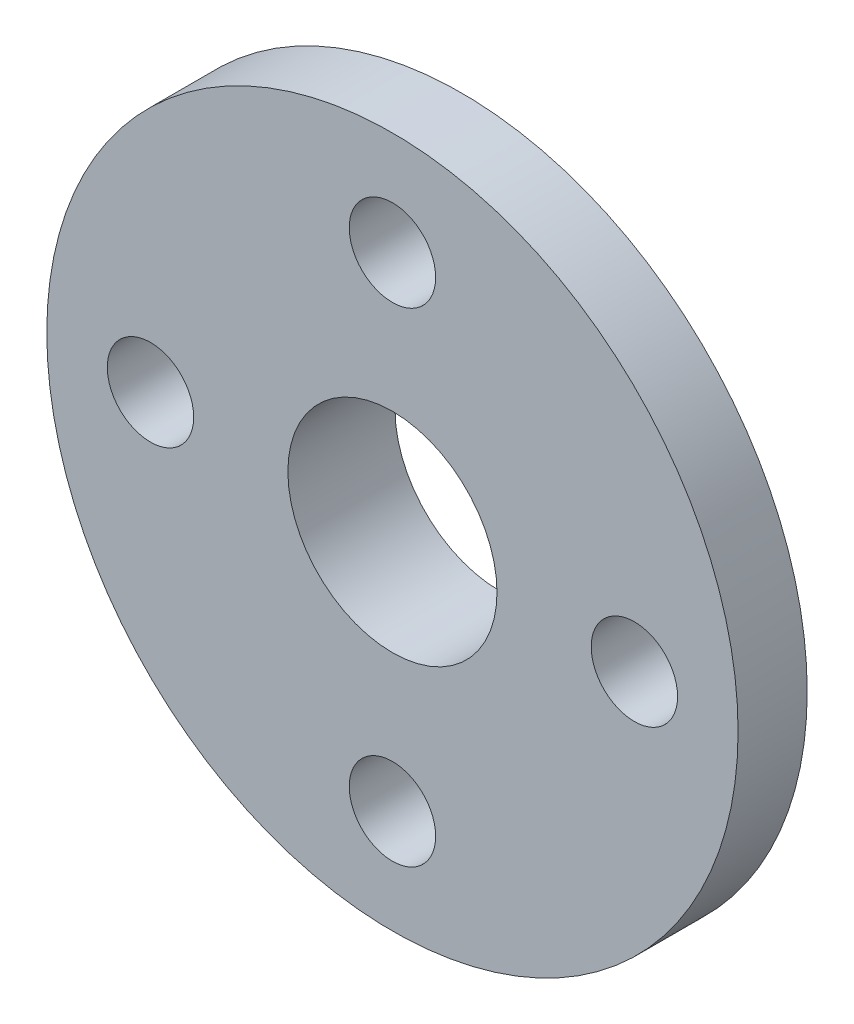
ISO-10303-21;
HEADER;
FILE_DESCRIPTION(('STEP AP214'),'2;1');
FILE_NAME('part.step','',(''),(''),'','','');
FILE_SCHEMA(('AUTOMOTIVE_DESIGN { 1 0 10303 214 1 1 1 1 }'));
ENDSEC;
DATA;
#1=APPLICATION_CONTEXT('core data for automotive mechanical design processes');
#2=APPLICATION_PROTOCOL_DEFINITION('international standard','automotive_design',2000,#1);
#3=PRODUCT_CONTEXT('',#1,'mechanical');
#4=PRODUCT('Part','Part','',(#3));
#5=PRODUCT_RELATED_PRODUCT_CATEGORY('part','',(#4));
#6=PRODUCT_DEFINITION_FORMATION('','',#4);
#7=PRODUCT_DEFINITION_CONTEXT('part definition',#1,'design');
#8=PRODUCT_DEFINITION('design','',#6,#7);
#9=PRODUCT_DEFINITION_SHAPE('','',#8);
#10=(LENGTH_UNIT() NAMED_UNIT(*) SI_UNIT(.MILLI.,.METRE.));
#11=(NAMED_UNIT(*) PLANE_ANGLE_UNIT() SI_UNIT($,.RADIAN.));
#12=(NAMED_UNIT(*) SI_UNIT($,.STERADIAN.) SOLID_ANGLE_UNIT());
#13=UNCERTAINTY_MEASURE_WITH_UNIT(LENGTH_MEASURE(1.E-05),#10,'distance_accuracy_value','');
#14=(GEOMETRIC_REPRESENTATION_CONTEXT(3) GLOBAL_UNCERTAINTY_ASSIGNED_CONTEXT((#13)) GLOBAL_UNIT_ASSIGNED_CONTEXT((#10,
#11,#12)) REPRESENTATION_CONTEXT('',''));
#15=CARTESIAN_POINT('',(0.,0.,0.));
#16=DIRECTION('',(0.,0.,1.));
#17=DIRECTION('',(1.,0.,0.));
#18=AXIS2_PLACEMENT_3D('',#15,#16,#17);
#19=CARTESIAN_POINT('',(-39.10264651977,-19.8999981269,6.716));
#20=DIRECTION('',(0.,0.,-1.));
#21=DIRECTION('',(-1.,0.,0.));
#22=AXIS2_PLACEMENT_3D('',#19,#20,#21);
#23=CYLINDRICAL_SURFACE('',#22,4.5);
#24=CARTESIAN_POINT('',(-39.10264651977,-19.8999981269,9.476));
#25=DIRECTION('',(0.,0.,-1.));
#26=DIRECTION('',(-1.,0.,0.));
#27=AXIS2_PLACEMENT_3D('',#24,#25,#26);
#28=CIRCLE('',#27,4.5);
#29=CARTESIAN_POINT('',(-43.60264651977,-19.8999981269,9.476));
#30=VERTEX_POINT('',#29);
#31=EDGE_CURVE('E17',#30,#30,#28,.F.);
#32=ORIENTED_EDGE('',*,*,#31,.F.);
#33=EDGE_LOOP('',(#32));
#34=FACE_BOUND('',#33,.T.);
#35=CARTESIAN_POINT('',(-39.10264651977,-19.8999981269,8.376));
#36=DIRECTION('',(0.,0.,-1.));
#37=DIRECTION('',(-1.,0.,0.));
#38=AXIS2_PLACEMENT_3D('',#35,#36,#37);
#39=CIRCLE('',#38,4.5);
#40=CARTESIAN_POINT('',(-43.60264651977,-19.8999981269,8.376));
#41=VERTEX_POINT('',#40);
#42=EDGE_CURVE('E57',#41,#41,#39,.F.);
#43=ORIENTED_EDGE('',*,*,#42,.T.);
#44=EDGE_LOOP('',(#43));
#45=FACE_BOUND('',#44,.T.);
#46=ADVANCED_FACE('F14',(#34,#45),#23,.T.);
#47=CARTESIAN_POINT('',(-39.10264565297,-19.9,9.476));
#48=DIRECTION('',(0.,0.,-1.));
#49=DIRECTION('',(-1.,0.,0.));
#50=AXIS2_PLACEMENT_3D('',#47,#48,#49);
#51=PLANE('',#50);
#52=CARTESIAN_POINT('',(-46.10264464667,-19.8999981269,9.476));
#53=DIRECTION('',(0.,0.,1.));
#54=DIRECTION('',(1.,0.,0.));
#55=AXIS2_PLACEMENT_3D('',#52,#53,#54);
#56=CIRCLE('',#55,1.25);
#57=CARTESIAN_POINT('',(-44.85264464667,-19.8999981269,9.476));
#58=VERTEX_POINT('',#57);
#59=EDGE_CURVE('E52',#58,#58,#56,.T.);
#60=ORIENTED_EDGE('',*,*,#59,.T.);
#61=EDGE_LOOP('',(#60));
#62=FACE_BOUND('',#61,.T.);
#63=CARTESIAN_POINT('',(-39.10264651977,-26.8999962538,9.476));
#64=DIRECTION('',(0.,0.,1.));
#65=DIRECTION('',(1.,0.,0.));
#66=AXIS2_PLACEMENT_3D('',#63,#64,#65);
#67=CIRCLE('',#66,1.25);
#68=CARTESIAN_POINT('',(-37.85264651977,-26.8999962538,9.476));
#69=VERTEX_POINT('',#68);
#70=EDGE_CURVE('E49',#69,#69,#67,.T.);
#71=ORIENTED_EDGE('',*,*,#70,.T.);
#72=EDGE_LOOP('',(#71));
#73=FACE_BOUND('',#72,.T.);
#74=CARTESIAN_POINT('',(-32.10264839287,-19.8999981269,9.476));
#75=DIRECTION('',(0.,0.,1.));
#76=DIRECTION('',(1.,0.,0.));
#77=AXIS2_PLACEMENT_3D('',#74,#75,#76);
#78=CIRCLE('',#77,1.25);
#79=CARTESIAN_POINT('',(-30.85264839287,-19.8999981269,9.476));
#80=VERTEX_POINT('',#79);
#81=EDGE_CURVE('E46',#80,#80,#78,.T.);
#82=ORIENTED_EDGE('',*,*,#81,.T.);
#83=EDGE_LOOP('',(#82));
#84=FACE_BOUND('',#83,.T.);
#85=CARTESIAN_POINT('',(-39.10264651977,-12.9,9.476));
#86=DIRECTION('',(0.,0.,1.));
#87=DIRECTION('',(1.,0.,0.));
#88=AXIS2_PLACEMENT_3D('',#85,#86,#87);
#89=CIRCLE('',#88,1.25);
#90=CARTESIAN_POINT('',(-37.85264651977,-12.9,9.476));
#91=VERTEX_POINT('',#90);
#92=EDGE_CURVE('E43',#91,#91,#89,.T.);
#93=ORIENTED_EDGE('',*,*,#92,.T.);
#94=EDGE_LOOP('',(#93));
#95=FACE_BOUND('',#94,.T.);
#96=ORIENTED_EDGE('',*,*,#31,.T.);
#97=EDGE_LOOP('',(#96));
#98=FACE_BOUND('',#97,.T.);
#99=CARTESIAN_POINT('',(-39.10264651977,-19.8999981269,9.476));
#100=DIRECTION('',(0.,0.,1.));
#101=DIRECTION('',(1.,0.,0.));
#102=AXIS2_PLACEMENT_3D('',#99,#100,#101);
#103=CIRCLE('',#102,10.);
#104=CARTESIAN_POINT('',(-29.10264651977,-19.8999981269,9.476));
#105=VERTEX_POINT('',#104);
#106=EDGE_CURVE('E55',#105,#105,#103,.T.);
#107=ORIENTED_EDGE('',*,*,#106,.F.);
#108=EDGE_LOOP('',(#107));
#109=FACE_BOUND('',#108,.T.);
#110=ADVANCED_FACE('F64',(#62,#73,#84,#95,#98,#109),#51,.T.);
#111=CARTESIAN_POINT('',(-28.10437565297,-19.9,8.376));
#112=DIRECTION('',(0.,0.,1.));
#113=DIRECTION('',(1.,0.,0.));
#114=AXIS2_PLACEMENT_3D('',#111,#112,#113);
#115=PLANE('',#114);
#116=CARTESIAN_POINT('',(-39.10264651977,-19.8999981269,8.376));
#117=DIRECTION('',(0.,0.,1.));
#118=DIRECTION('',(1.,0.,0.));
#119=AXIS2_PLACEMENT_3D('',#116,#117,#118);
#120=CIRCLE('',#119,3.025);
#121=CARTESIAN_POINT('',(-36.07764651977,-19.8999981269,8.376));
#122=VERTEX_POINT('',#121);
#123=EDGE_CURVE('E40',#122,#122,#120,.T.);
#124=ORIENTED_EDGE('',*,*,#123,.T.);
#125=EDGE_LOOP('',(#124));
#126=FACE_BOUND('',#125,.T.);
#127=ORIENTED_EDGE('',*,*,#42,.F.);
#128=EDGE_LOOP('',(#127));
#129=FACE_BOUND('',#128,.T.);
#130=ADVANCED_FACE('F72',(#126,#129),#115,.F.);
#131=CARTESIAN_POINT('',(-39.10264651977,-19.8999981269,11.476));
#132=DIRECTION('',(0.,0.,1.));
#133=DIRECTION('',(1.,0.,0.));
#134=AXIS2_PLACEMENT_3D('',#131,#132,#133);
#135=CYLINDRICAL_SURFACE('',#134,10.);
#136=ORIENTED_EDGE('',*,*,#106,.T.);
#137=EDGE_LOOP('',(#136));
#138=FACE_BOUND('',#137,.T.);
#139=CARTESIAN_POINT('',(-39.10264651977,-19.8999981269,11.476));
#140=DIRECTION('',(0.,0.,1.));
#141=DIRECTION('',(1.,0.,0.));
#142=AXIS2_PLACEMENT_3D('',#139,#140,#141);
#143=CIRCLE('',#142,10.);
#144=CARTESIAN_POINT('',(-29.10264651977,-19.8999981269,11.476));
#145=VERTEX_POINT('',#144);
#146=EDGE_CURVE('E37',#145,#145,#143,.F.);
#147=ORIENTED_EDGE('',*,*,#146,.T.);
#148=EDGE_LOOP('',(#147));
#149=FACE_BOUND('',#148,.T.);
#150=ADVANCED_FACE('F100',(#138,#149),#135,.T.);
#151=CARTESIAN_POINT('',(-46.10264464667,-19.8999981269,11.476));
#152=DIRECTION('',(0.,0.,1.));
#153=DIRECTION('',(1.,0.,0.));
#154=AXIS2_PLACEMENT_3D('',#151,#152,#153);
#155=CYLINDRICAL_SURFACE('',#154,1.25);
#156=CARTESIAN_POINT('',(-46.10264464667,-19.8999981269,11.476));
#157=DIRECTION('',(0.,0.,1.));
#158=DIRECTION('',(1.,0.,0.));
#159=AXIS2_PLACEMENT_3D('',#156,#157,#158);
#160=CIRCLE('',#159,1.25);
#161=CARTESIAN_POINT('',(-44.85264464667,-19.8999981269,11.476));
#162=VERTEX_POINT('',#161);
#163=EDGE_CURVE('E34',#162,#162,#160,.T.);
#164=ORIENTED_EDGE('',*,*,#163,.T.);
#165=EDGE_LOOP('',(#164));
#166=FACE_BOUND('',#165,.T.);
#167=ORIENTED_EDGE('',*,*,#59,.F.);
#168=EDGE_LOOP('',(#167));
#169=FACE_BOUND('',#168,.T.);
#170=ADVANCED_FACE('F96',(#166,#169),#155,.F.);
#171=CARTESIAN_POINT('',(-39.10264651977,-26.8999962538,11.476));
#172=DIRECTION('',(0.,0.,1.));
#173=DIRECTION('',(1.,0.,0.));
#174=AXIS2_PLACEMENT_3D('',#171,#172,#173);
#175=CYLINDRICAL_SURFACE('',#174,1.25);
#176=CARTESIAN_POINT('',(-39.10264651977,-26.8999962538,11.476));
#177=DIRECTION('',(0.,0.,1.));
#178=DIRECTION('',(1.,0.,0.));
#179=AXIS2_PLACEMENT_3D('',#176,#177,#178);
#180=CIRCLE('',#179,1.25);
#181=CARTESIAN_POINT('',(-37.85264651977,-26.8999962538,11.476));
#182=VERTEX_POINT('',#181);
#183=EDGE_CURVE('E31',#182,#182,#180,.T.);
#184=ORIENTED_EDGE('',*,*,#183,.T.);
#185=EDGE_LOOP('',(#184));
#186=FACE_BOUND('',#185,.T.);
#187=ORIENTED_EDGE('',*,*,#70,.F.);
#188=EDGE_LOOP('',(#187));
#189=FACE_BOUND('',#188,.T.);
#190=ADVANCED_FACE('F92',(#186,#189),#175,.F.);
#191=CARTESIAN_POINT('',(-32.10264839287,-19.8999981269,11.476));
#192=DIRECTION('',(0.,0.,1.));
#193=DIRECTION('',(1.,0.,0.));
#194=AXIS2_PLACEMENT_3D('',#191,#192,#193);
#195=CYLINDRICAL_SURFACE('',#194,1.25);
#196=CARTESIAN_POINT('',(-32.10264839287,-19.8999981269,11.476));
#197=DIRECTION('',(0.,0.,1.));
#198=DIRECTION('',(1.,0.,0.));
#199=AXIS2_PLACEMENT_3D('',#196,#197,#198);
#200=CIRCLE('',#199,1.25);
#201=CARTESIAN_POINT('',(-30.85264839287,-19.8999981269,11.476));
#202=VERTEX_POINT('',#201);
#203=EDGE_CURVE('E26',#202,#202,#200,.T.);
#204=ORIENTED_EDGE('',*,*,#203,.T.);
#205=EDGE_LOOP('',(#204));
#206=FACE_BOUND('',#205,.T.);
#207=ORIENTED_EDGE('',*,*,#81,.F.);
#208=EDGE_LOOP('',(#207));
#209=FACE_BOUND('',#208,.T.);
#210=ADVANCED_FACE('F88',(#206,#209),#195,.F.);
#211=CARTESIAN_POINT('',(-39.10264651977,-12.9,11.476));
#212=DIRECTION('',(0.,0.,1.));
#213=DIRECTION('',(1.,0.,0.));
#214=AXIS2_PLACEMENT_3D('',#211,#212,#213);
#215=CYLINDRICAL_SURFACE('',#214,1.25);
#216=CARTESIAN_POINT('',(-39.10264651977,-12.9,11.476));
#217=DIRECTION('',(0.,0.,1.));
#218=DIRECTION('',(1.,0.,0.));
#219=AXIS2_PLACEMENT_3D('',#216,#217,#218);
#220=CIRCLE('',#219,1.25);
#221=CARTESIAN_POINT('',(-37.85264651977,-12.9,11.476));
#222=VERTEX_POINT('',#221);
#223=EDGE_CURVE('E21',#222,#222,#220,.T.);
#224=ORIENTED_EDGE('',*,*,#223,.T.);
#225=EDGE_LOOP('',(#224));
#226=FACE_BOUND('',#225,.T.);
#227=ORIENTED_EDGE('',*,*,#92,.F.);
#228=EDGE_LOOP('',(#227));
#229=FACE_BOUND('',#228,.T.);
#230=ADVANCED_FACE('F82',(#226,#229),#215,.F.);
#231=CARTESIAN_POINT('',(-39.10264651977,-19.8999981269,12.426));
#232=DIRECTION('',(0.,0.,1.));
#233=DIRECTION('',(1.,0.,0.));
#234=AXIS2_PLACEMENT_3D('',#231,#232,#233);
#235=CYLINDRICAL_SURFACE('',#234,3.025);
#236=CARTESIAN_POINT('',(-39.10264651977,-19.8999981269,11.476));
#237=DIRECTION('',(0.,0.,1.));
#238=DIRECTION('',(1.,0.,0.));
#239=AXIS2_PLACEMENT_3D('',#236,#237,#238);
#240=CIRCLE('',#239,3.025);
#241=CARTESIAN_POINT('',(-36.07764651977,-19.8999981269,11.476));
#242=VERTEX_POINT('',#241);
#243=EDGE_CURVE('E9',#242,#242,#240,.T.);
#244=ORIENTED_EDGE('',*,*,#243,.T.);
#245=EDGE_LOOP('',(#244));
#246=FACE_BOUND('',#245,.T.);
#247=ORIENTED_EDGE('',*,*,#123,.F.);
#248=EDGE_LOOP('',(#247));
#249=FACE_BOUND('',#248,.T.);
#250=ADVANCED_FACE('F76',(#246,#249),#235,.F.);
#251=CARTESIAN_POINT('',(-28.10437565297,-19.9,11.476));
#252=DIRECTION('',(0.,0.,-1.));
#253=DIRECTION('',(-1.,0.,0.));
#254=AXIS2_PLACEMENT_3D('',#251,#252,#253);
#255=PLANE('',#254);
#256=ORIENTED_EDGE('',*,*,#243,.F.);
#257=EDGE_LOOP('',(#256));
#258=FACE_BOUND('',#257,.T.);
#259=ORIENTED_EDGE('',*,*,#223,.F.);
#260=EDGE_LOOP('',(#259));
#261=FACE_BOUND('',#260,.T.);
#262=ORIENTED_EDGE('',*,*,#203,.F.);
#263=EDGE_LOOP('',(#262));
#264=FACE_BOUND('',#263,.T.);
#265=ORIENTED_EDGE('',*,*,#183,.F.);
#266=EDGE_LOOP('',(#265));
#267=FACE_BOUND('',#266,.T.);
#268=ORIENTED_EDGE('',*,*,#163,.F.);
#269=EDGE_LOOP('',(#268));
#270=FACE_BOUND('',#269,.T.);
#271=ORIENTED_EDGE('',*,*,#146,.F.);
#272=EDGE_LOOP('',(#271));
#273=FACE_BOUND('',#272,.T.);
#274=ADVANCED_FACE('F74',(#258,#261,#264,#267,#270,#273),#255,.F.);
#275=CLOSED_SHELL('',(#46,#110,#130,#150,#170,#190,#210,#230,#250,#274));
#276=MANIFOLD_SOLID_BREP('B1',#275);
#277=ADVANCED_BREP_SHAPE_REPRESENTATION('',(#18,#276),#14);
#278=SHAPE_DEFINITION_REPRESENTATION(#9,#277);
ENDSEC;
END-ISO-10303-21;
